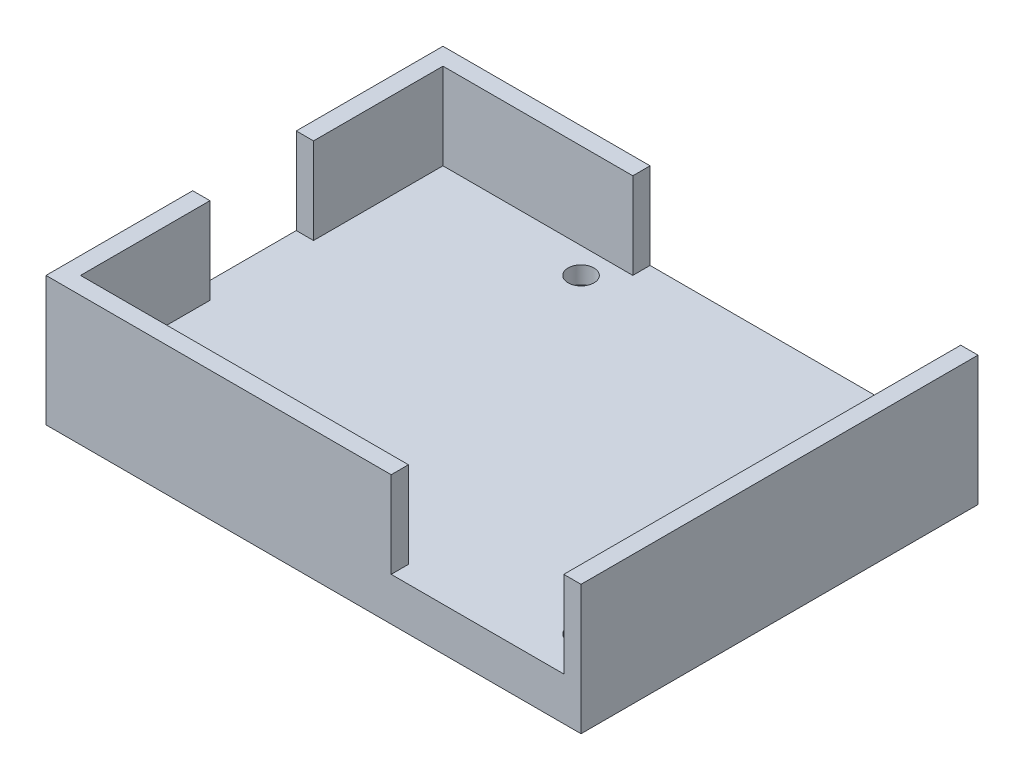
ISO-10303-21;
HEADER;
FILE_DESCRIPTION(('STEP AP214'),'2;1');
FILE_NAME('part.step','',(''),(''),'','','');
FILE_SCHEMA(('AUTOMOTIVE_DESIGN { 1 0 10303 214 1 1 1 1 }'));
ENDSEC;
DATA;
#1=APPLICATION_CONTEXT('core data for automotive mechanical design processes');
#2=APPLICATION_PROTOCOL_DEFINITION('international standard','automotive_design',2000,#1);
#3=PRODUCT_CONTEXT('',#1,'mechanical');
#4=PRODUCT('Part','Part','',(#3));
#5=PRODUCT_RELATED_PRODUCT_CATEGORY('part','',(#4));
#6=PRODUCT_DEFINITION_FORMATION('','',#4);
#7=PRODUCT_DEFINITION_CONTEXT('part definition',#1,'design');
#8=PRODUCT_DEFINITION('design','',#6,#7);
#9=PRODUCT_DEFINITION_SHAPE('','',#8);
#10=(LENGTH_UNIT() NAMED_UNIT(*) SI_UNIT(.MILLI.,.METRE.));
#11=(NAMED_UNIT(*) PLANE_ANGLE_UNIT() SI_UNIT($,.RADIAN.));
#12=(NAMED_UNIT(*) SI_UNIT($,.STERADIAN.) SOLID_ANGLE_UNIT());
#13=UNCERTAINTY_MEASURE_WITH_UNIT(LENGTH_MEASURE(1.E-05),#10,'distance_accuracy_value','');
#14=(GEOMETRIC_REPRESENTATION_CONTEXT(3) GLOBAL_UNCERTAINTY_ASSIGNED_CONTEXT((#13)) GLOBAL_UNIT_ASSIGNED_CONTEXT((#10,
#11,#12)) REPRESENTATION_CONTEXT('',''));
#15=CARTESIAN_POINT('',(0.,0.,0.));
#16=DIRECTION('',(0.,0.,1.));
#17=DIRECTION('',(1.,0.,0.));
#18=AXIS2_PLACEMENT_3D('',#15,#16,#17);
#19=CARTESIAN_POINT('',(26.,0.,18.));
#20=DIRECTION('',(0.,1.,0.));
#21=DIRECTION('',(0.,0.,1.));
#22=AXIS2_PLACEMENT_3D('',#19,#20,#21);
#23=CYLINDRICAL_SURFACE('',#22,1.5);
#24=CARTESIAN_POINT('',(26.,5.,18.));
#25=DIRECTION('',(0.,1.,0.));
#26=DIRECTION('',(0.,0.,1.));
#27=AXIS2_PLACEMENT_3D('',#24,#25,#26);
#28=CIRCLE('',#27,1.5);
#29=CARTESIAN_POINT('',(26.,5.,19.5));
#30=VERTEX_POINT('',#29);
#31=EDGE_CURVE('E182',#30,#30,#28,.T.);
#32=ORIENTED_EDGE('',*,*,#31,.T.);
#33=EDGE_LOOP('',(#32));
#34=FACE_BOUND('',#33,.T.);
#35=CARTESIAN_POINT('',(26.,3.,18.));
#36=DIRECTION('',(0.,-1.,0.));
#37=DIRECTION('',(0.,0.,-1.));
#38=AXIS2_PLACEMENT_3D('',#35,#36,#37);
#39=CIRCLE('',#38,1.5);
#40=CARTESIAN_POINT('',(26.,3.,16.5));
#41=VERTEX_POINT('',#40);
#42=EDGE_CURVE('E39',#41,#41,#39,.F.);
#43=ORIENTED_EDGE('',*,*,#42,.F.);
#44=EDGE_LOOP('',(#43));
#45=FACE_BOUND('',#44,.T.);
#46=ADVANCED_FACE('F35',(#34,#45),#23,.F.);
#47=CARTESIAN_POINT('',(26.,0.,-18.));
#48=DIRECTION('',(0.,1.,0.));
#49=DIRECTION('',(0.,0.,1.));
#50=AXIS2_PLACEMENT_3D('',#47,#48,#49);
#51=CYLINDRICAL_SURFACE('',#50,1.5);
#52=CARTESIAN_POINT('',(26.,5.,-18.));
#53=DIRECTION('',(0.,1.,0.));
#54=DIRECTION('',(0.,0.,1.));
#55=AXIS2_PLACEMENT_3D('',#52,#53,#54);
#56=CIRCLE('',#55,1.5);
#57=CARTESIAN_POINT('',(26.,5.,-16.5));
#58=VERTEX_POINT('',#57);
#59=EDGE_CURVE('E293',#58,#58,#56,.T.);
#60=ORIENTED_EDGE('',*,*,#59,.T.);
#61=EDGE_LOOP('',(#60));
#62=FACE_BOUND('',#61,.T.);
#63=CARTESIAN_POINT('',(26.,3.,-18.));
#64=DIRECTION('',(0.,-1.,0.));
#65=DIRECTION('',(0.,0.,-1.));
#66=AXIS2_PLACEMENT_3D('',#63,#64,#65);
#67=CIRCLE('',#66,1.5);
#68=CARTESIAN_POINT('',(26.,3.,-19.5));
#69=VERTEX_POINT('',#68);
#70=EDGE_CURVE('E279',#69,#69,#67,.F.);
#71=ORIENTED_EDGE('',*,*,#70,.F.);
#72=EDGE_LOOP('',(#71));
#73=FACE_BOUND('',#72,.T.);
#74=ADVANCED_FACE('F381',(#62,#73),#51,.F.);
#75=CARTESIAN_POINT('',(-10.,0.,-18.));
#76=DIRECTION('',(0.,1.,0.));
#77=DIRECTION('',(0.,0.,1.));
#78=AXIS2_PLACEMENT_3D('',#75,#76,#77);
#79=CYLINDRICAL_SURFACE('',#78,1.5);
#80=CARTESIAN_POINT('',(-10.,5.,-18.));
#81=DIRECTION('',(0.,1.,0.));
#82=DIRECTION('',(0.,0.,1.));
#83=AXIS2_PLACEMENT_3D('',#80,#81,#82);
#84=CIRCLE('',#83,1.5);
#85=CARTESIAN_POINT('',(-10.,5.,-16.5));
#86=VERTEX_POINT('',#85);
#87=EDGE_CURVE('E288',#86,#86,#84,.T.);
#88=ORIENTED_EDGE('',*,*,#87,.T.);
#89=EDGE_LOOP('',(#88));
#90=FACE_BOUND('',#89,.T.);
#91=CARTESIAN_POINT('',(-10.,3.,-18.));
#92=DIRECTION('',(0.,-1.,0.));
#93=DIRECTION('',(0.,0.,-1.));
#94=AXIS2_PLACEMENT_3D('',#91,#92,#93);
#95=CIRCLE('',#94,1.5);
#96=CARTESIAN_POINT('',(-10.,3.,-19.5));
#97=VERTEX_POINT('',#96);
#98=EDGE_CURVE('E276',#97,#97,#95,.F.);
#99=ORIENTED_EDGE('',*,*,#98,.F.);
#100=EDGE_LOOP('',(#99));
#101=FACE_BOUND('',#100,.T.);
#102=ADVANCED_FACE('F375',(#90,#101),#79,.F.);
#103=CARTESIAN_POINT('',(-9.99999999999999,0.,18.));
#104=DIRECTION('',(0.,1.,0.));
#105=DIRECTION('',(0.,0.,1.));
#106=AXIS2_PLACEMENT_3D('',#103,#104,#105);
#107=CYLINDRICAL_SURFACE('',#106,1.5);
#108=CARTESIAN_POINT('',(-9.99999999999999,5.,18.));
#109=DIRECTION('',(0.,1.,0.));
#110=DIRECTION('',(0.,0.,1.));
#111=AXIS2_PLACEMENT_3D('',#108,#109,#110);
#112=CIRCLE('',#111,1.5);
#113=CARTESIAN_POINT('',(-9.99999999999999,5.,19.5));
#114=VERTEX_POINT('',#113);
#115=EDGE_CURVE('E284',#114,#114,#112,.T.);
#116=ORIENTED_EDGE('',*,*,#115,.T.);
#117=EDGE_LOOP('',(#116));
#118=FACE_BOUND('',#117,.T.);
#119=CARTESIAN_POINT('',(-9.99999999999999,3.,18.));
#120=DIRECTION('',(0.,-1.,0.));
#121=DIRECTION('',(0.,0.,-1.));
#122=AXIS2_PLACEMENT_3D('',#119,#120,#121);
#123=CIRCLE('',#122,1.5);
#124=CARTESIAN_POINT('',(-9.99999999999999,3.,16.5));
#125=VERTEX_POINT('',#124);
#126=EDGE_CURVE('E273',#125,#125,#123,.F.);
#127=ORIENTED_EDGE('',*,*,#126,.F.);
#128=EDGE_LOOP('',(#127));
#129=FACE_BOUND('',#128,.T.);
#130=ADVANCED_FACE('F367',(#118,#129),#107,.F.);
#131=CARTESIAN_POINT('',(0.,15.,0.));
#132=DIRECTION('',(0.,1.,0.));
#133=DIRECTION('',(0.,0.,1.));
#134=AXIS2_PLACEMENT_3D('',#131,#132,#133);
#135=PLANE('',#134);
#136=DIRECTION('',(0.,0.,-1.));
#137=VECTOR('',#136,1.);
#138=CARTESIAN_POINT('',(29.,15.,-21.));
#139=LINE('',#138,#137);
#140=CARTESIAN_POINT('',(29.,15.,23.));
#141=VERTEX_POINT('',#140);
#142=CARTESIAN_POINT('',(29.,15.,-23.));
#143=VERTEX_POINT('',#142);
#144=EDGE_CURVE('E218',#141,#143,#139,.T.);
#145=ORIENTED_EDGE('',*,*,#144,.F.);
#146=DIRECTION('',(1.,0.,0.));
#147=VECTOR('',#146,1.);
#148=CARTESIAN_POINT('',(-31.,15.,23.));
#149=LINE('',#148,#147);
#150=CARTESIAN_POINT('',(31.,15.,23.));
#151=VERTEX_POINT('',#150);
#152=EDGE_CURVE('E177',#141,#151,#149,.T.);
#153=ORIENTED_EDGE('',*,*,#152,.T.);
#154=DIRECTION('',(0.,0.,-1.));
#155=VECTOR('',#154,1.);
#156=CARTESIAN_POINT('',(31.,15.,-23.));
#157=LINE('',#156,#155);
#158=CARTESIAN_POINT('',(31.,15.,-23.));
#159=VERTEX_POINT('',#158);
#160=EDGE_CURVE('E243',#151,#159,#157,.T.);
#161=ORIENTED_EDGE('',*,*,#160,.T.);
#162=DIRECTION('',(-1.,0.,0.));
#163=VECTOR('',#162,1.);
#164=CARTESIAN_POINT('',(-31.,15.,-23.));
#165=LINE('',#164,#163);
#166=EDGE_CURVE('E248',#159,#143,#165,.T.);
#167=ORIENTED_EDGE('',*,*,#166,.T.);
#168=EDGE_LOOP('',(#145,#153,#161,#167));
#169=FACE_BOUND('',#168,.T.);
#170=ADVANCED_FACE('F364',(#169),#135,.T.);
#171=DIRECTION('',(0.,0.,-1.));
#172=VECTOR('',#171,1.);
#173=CARTESIAN_POINT('',(9.00000000000001,15.,23.001));
#174=LINE('',#173,#172);
#175=CARTESIAN_POINT('',(9.00000000000001,15.,23.));
#176=VERTEX_POINT('',#175);
#177=CARTESIAN_POINT('',(9.00000000000001,15.,21.));
#178=VERTEX_POINT('',#177);
#179=EDGE_CURVE('E173',#176,#178,#174,.T.);
#180=ORIENTED_EDGE('',*,*,#179,.T.);
#181=DIRECTION('',(1.,0.,0.));
#182=VECTOR('',#181,1.);
#183=CARTESIAN_POINT('',(-29.,15.,21.));
#184=LINE('',#183,#182);
#185=CARTESIAN_POINT('',(-29.,15.,21.));
#186=VERTEX_POINT('',#185);
#187=EDGE_CURVE('E162',#186,#178,#184,.T.);
#188=ORIENTED_EDGE('',*,*,#187,.F.);
#189=DIRECTION('',(0.,0.,1.));
#190=VECTOR('',#189,1.);
#191=CARTESIAN_POINT('',(-29.,15.,-21.));
#192=LINE('',#191,#190);
#193=CARTESIAN_POINT('',(-29.,15.,6.00000000000001));
#194=VERTEX_POINT('',#193);
#195=EDGE_CURVE('E231',#194,#186,#192,.T.);
#196=ORIENTED_EDGE('',*,*,#195,.F.);
#197=DIRECTION('',(-1.,0.,0.));
#198=VECTOR('',#197,1.);
#199=CARTESIAN_POINT('',(31.001,15.,5.99999999999999));
#200=LINE('',#199,#198);
#201=CARTESIAN_POINT('',(-31.,15.,6.00000000000001));
#202=VERTEX_POINT('',#201);
#203=EDGE_CURVE('E201',#194,#202,#200,.T.);
#204=ORIENTED_EDGE('',*,*,#203,.T.);
#205=DIRECTION('',(0.,0.,1.));
#206=VECTOR('',#205,1.);
#207=CARTESIAN_POINT('',(-31.,15.,-23.));
#208=LINE('',#207,#206);
#209=CARTESIAN_POINT('',(-31.,15.,23.));
#210=VERTEX_POINT('',#209);
#211=EDGE_CURVE('E251',#202,#210,#208,.T.);
#212=ORIENTED_EDGE('',*,*,#211,.T.);
#213=EDGE_CURVE('E255',#210,#176,#149,.T.);
#214=ORIENTED_EDGE('',*,*,#213,.T.);
#215=EDGE_LOOP('',(#180,#188,#196,#204,#212,#214));
#216=FACE_BOUND('',#215,.T.);
#217=ADVANCED_FACE('F366',(#216),#135,.T.);
#218=CARTESIAN_POINT('',(-29.,5.,-21.));
#219=DIRECTION('',(-1.,0.,0.));
#220=DIRECTION('',(0.,0.,1.));
#221=AXIS2_PLACEMENT_3D('',#218,#219,#220);
#222=PLANE('',#221);
#223=CARTESIAN_POINT('',(-29.,15.,-21.));
#224=VERTEX_POINT('',#223);
#225=CARTESIAN_POINT('',(-29.,15.,-5.99999999999999));
#226=VERTEX_POINT('',#225);
#227=EDGE_CURVE('E232',#224,#226,#192,.T.);
#228=ORIENTED_EDGE('',*,*,#227,.T.);
#229=DIRECTION('',(0.,1.,0.));
#230=VECTOR('',#229,1.);
#231=CARTESIAN_POINT('',(-29.,25.,-5.99999999999999));
#232=LINE('',#231,#230);
#233=CARTESIAN_POINT('',(-29.,5.,-5.99999999999999));
#234=VERTEX_POINT('',#233);
#235=EDGE_CURVE('E216',#234,#226,#232,.T.);
#236=ORIENTED_EDGE('',*,*,#235,.F.);
#237=DIRECTION('',(0.,0.,1.));
#238=VECTOR('',#237,1.);
#239=CARTESIAN_POINT('',(-29.,5.,-21.));
#240=LINE('',#239,#238);
#241=CARTESIAN_POINT('',(-29.,5.,-21.));
#242=VERTEX_POINT('',#241);
#243=EDGE_CURVE('E222',#242,#234,#240,.T.);
#244=ORIENTED_EDGE('',*,*,#243,.F.);
#245=DIRECTION('',(0.,1.,0.));
#246=VECTOR('',#245,1.);
#247=CARTESIAN_POINT('',(-29.,5.,-21.));
#248=LINE('',#247,#246);
#249=EDGE_CURVE('E227',#242,#224,#248,.T.);
#250=ORIENTED_EDGE('',*,*,#249,.T.);
#251=EDGE_LOOP('',(#228,#236,#244,#250));
#252=FACE_BOUND('',#251,.T.);
#253=ADVANCED_FACE('F373',(#252),#222,.F.);
#254=CARTESIAN_POINT('',(31.,15.,-23.));
#255=DIRECTION('',(-1.,0.,0.));
#256=DIRECTION('',(0.,0.,1.));
#257=AXIS2_PLACEMENT_3D('',#254,#255,#256);
#258=PLANE('',#257);
#259=DIRECTION('',(0.,0.,-1.));
#260=VECTOR('',#259,1.);
#261=CARTESIAN_POINT('',(31.,0.,-23.));
#262=LINE('',#261,#260);
#263=CARTESIAN_POINT('',(31.,0.,23.));
#264=VERTEX_POINT('',#263);
#265=CARTESIAN_POINT('',(31.,0.,-23.));
#266=VERTEX_POINT('',#265);
#267=EDGE_CURVE('E240',#264,#266,#262,.T.);
#268=ORIENTED_EDGE('',*,*,#267,.T.);
#269=DIRECTION('',(0.,-1.,0.));
#270=VECTOR('',#269,1.);
#271=CARTESIAN_POINT('',(31.,15.,-23.));
#272=LINE('',#271,#270);
#273=EDGE_CURVE('E11',#159,#266,#272,.T.);
#274=ORIENTED_EDGE('',*,*,#273,.F.);
#275=ORIENTED_EDGE('',*,*,#160,.F.);
#276=DIRECTION('',(0.,-1.,0.));
#277=VECTOR('',#276,1.);
#278=CARTESIAN_POINT('',(31.,15.,23.));
#279=LINE('',#278,#277);
#280=EDGE_CURVE('E258',#151,#264,#279,.T.);
#281=ORIENTED_EDGE('',*,*,#280,.T.);
#282=EDGE_LOOP('',(#268,#274,#275,#281));
#283=FACE_BOUND('',#282,.T.);
#284=ADVANCED_FACE('F37',(#283),#258,.F.);
#285=CARTESIAN_POINT('',(-31.,15.,-23.));
#286=DIRECTION('',(0.,0.,1.));
#287=DIRECTION('',(1.,0.,0.));
#288=AXIS2_PLACEMENT_3D('',#285,#286,#287);
#289=PLANE('',#288);
#290=DIRECTION('',(-1.,0.,0.));
#291=VECTOR('',#290,1.);
#292=CARTESIAN_POINT('',(29.,5.,-23.));
#293=LINE('',#292,#291);
#294=CARTESIAN_POINT('',(29.,5.,-23.));
#295=VERTEX_POINT('',#294);
#296=CARTESIAN_POINT('',(-7.,5.,-23.));
#297=VERTEX_POINT('',#296);
#298=EDGE_CURVE('E190',#295,#297,#293,.T.);
#299=ORIENTED_EDGE('',*,*,#298,.F.);
#300=DIRECTION('',(0.,-1.,0.));
#301=VECTOR('',#300,1.);
#302=CARTESIAN_POINT('',(29.,15.,-23.));
#303=LINE('',#302,#301);
#304=EDGE_CURVE('E157',#143,#295,#303,.T.);
#305=ORIENTED_EDGE('',*,*,#304,.F.);
#306=ORIENTED_EDGE('',*,*,#166,.F.);
#307=ORIENTED_EDGE('',*,*,#273,.T.);
#308=DIRECTION('',(-1.,0.,0.));
#309=VECTOR('',#308,1.);
#310=CARTESIAN_POINT('',(-31.,0.,-23.));
#311=LINE('',#310,#309);
#312=CARTESIAN_POINT('',(-31.,0.,-23.));
#313=VERTEX_POINT('',#312);
#314=EDGE_CURVE('E261',#266,#313,#311,.T.);
#315=ORIENTED_EDGE('',*,*,#314,.T.);
#316=DIRECTION('',(0.,-1.,0.));
#317=VECTOR('',#316,1.);
#318=CARTESIAN_POINT('',(-31.,15.,-23.));
#319=LINE('',#318,#317);
#320=CARTESIAN_POINT('',(-31.,15.,-23.));
#321=VERTEX_POINT('',#320);
#322=EDGE_CURVE('E44',#321,#313,#319,.T.);
#323=ORIENTED_EDGE('',*,*,#322,.F.);
#324=CARTESIAN_POINT('',(-7.,15.,-23.));
#325=VERTEX_POINT('',#324);
#326=EDGE_CURVE('E246',#325,#321,#165,.T.);
#327=ORIENTED_EDGE('',*,*,#326,.F.);
#328=DIRECTION('',(0.,1.,0.));
#329=VECTOR('',#328,1.);
#330=CARTESIAN_POINT('',(-7.,15.,-23.));
#331=LINE('',#330,#329);
#332=EDGE_CURVE('E172',#297,#325,#331,.T.);
#333=ORIENTED_EDGE('',*,*,#332,.F.);
#334=EDGE_LOOP('',(#299,#305,#306,#307,#315,#323,#327,#333));
#335=FACE_BOUND('',#334,.T.);
#336=ADVANCED_FACE('F361',(#335),#289,.F.);
#337=CARTESIAN_POINT('',(-31.,15.,-23.));
#338=DIRECTION('',(1.,0.,0.));
#339=DIRECTION('',(0.,0.,-1.));
#340=AXIS2_PLACEMENT_3D('',#337,#338,#339);
#341=PLANE('',#340);
#342=DIRECTION('',(0.,0.,1.));
#343=VECTOR('',#342,1.);
#344=CARTESIAN_POINT('',(-31.,5.,-5.99999999999999));
#345=LINE('',#344,#343);
#346=CARTESIAN_POINT('',(-31.,5.,-5.99999999999999));
#347=VERTEX_POINT('',#346);
#348=CARTESIAN_POINT('',(-31.,5.,6.00000000000001));
#349=VERTEX_POINT('',#348);
#350=EDGE_CURVE('E208',#347,#349,#345,.T.);
#351=ORIENTED_EDGE('',*,*,#350,.F.);
#352=DIRECTION('',(0.,-1.,0.));
#353=VECTOR('',#352,1.);
#354=CARTESIAN_POINT('',(-31.,25.,-5.99999999999999));
#355=LINE('',#354,#353);
#356=CARTESIAN_POINT('',(-31.,15.,-5.99999999999999));
#357=VERTEX_POINT('',#356);
#358=EDGE_CURVE('E205',#357,#347,#355,.T.);
#359=ORIENTED_EDGE('',*,*,#358,.F.);
#360=EDGE_CURVE('E252',#321,#357,#208,.T.);
#361=ORIENTED_EDGE('',*,*,#360,.F.);
#362=ORIENTED_EDGE('',*,*,#322,.T.);
#363=DIRECTION('',(0.,0.,1.));
#364=VECTOR('',#363,1.);
#365=CARTESIAN_POINT('',(-31.,0.,-23.));
#366=LINE('',#365,#364);
#367=CARTESIAN_POINT('',(-31.,0.,23.));
#368=VERTEX_POINT('',#367);
#369=EDGE_CURVE('E263',#313,#368,#366,.T.);
#370=ORIENTED_EDGE('',*,*,#369,.T.);
#371=DIRECTION('',(0.,-1.,0.));
#372=VECTOR('',#371,1.);
#373=CARTESIAN_POINT('',(-31.,15.,23.));
#374=LINE('',#373,#372);
#375=EDGE_CURVE('E268',#210,#368,#374,.T.);
#376=ORIENTED_EDGE('',*,*,#375,.F.);
#377=ORIENTED_EDGE('',*,*,#211,.F.);
#378=DIRECTION('',(0.,1.,0.));
#379=VECTOR('',#378,1.);
#380=CARTESIAN_POINT('',(-31.,25.,6.00000000000001));
#381=LINE('',#380,#379);
#382=EDGE_CURVE('E211',#349,#202,#381,.T.);
#383=ORIENTED_EDGE('',*,*,#382,.F.);
#384=EDGE_LOOP('',(#351,#359,#361,#362,#370,#376,#377,#383));
#385=FACE_BOUND('',#384,.T.);
#386=ADVANCED_FACE('F354',(#385),#341,.F.);
#387=CARTESIAN_POINT('',(-31.,15.,23.));
#388=DIRECTION('',(0.,0.,-1.));
#389=DIRECTION('',(-1.,0.,0.));
#390=AXIS2_PLACEMENT_3D('',#387,#388,#389);
#391=PLANE('',#390);
#392=ORIENTED_EDGE('',*,*,#152,.F.);
#393=DIRECTION('',(0.,1.,0.));
#394=VECTOR('',#393,1.);
#395=CARTESIAN_POINT('',(29.,15.,23.));
#396=LINE('',#395,#394);
#397=CARTESIAN_POINT('',(29.,5.,23.));
#398=VERTEX_POINT('',#397);
#399=EDGE_CURVE('E154',#398,#141,#396,.T.);
#400=ORIENTED_EDGE('',*,*,#399,.F.);
#401=DIRECTION('',(1.,0.,0.));
#402=VECTOR('',#401,1.);
#403=CARTESIAN_POINT('',(29.,5.,23.));
#404=LINE('',#403,#402);
#405=CARTESIAN_POINT('',(9.00000000000001,5.,23.));
#406=VERTEX_POINT('',#405);
#407=EDGE_CURVE('E165',#406,#398,#404,.T.);
#408=ORIENTED_EDGE('',*,*,#407,.F.);
#409=DIRECTION('',(0.,-1.,0.));
#410=VECTOR('',#409,1.);
#411=CARTESIAN_POINT('',(9.00000000000001,15.,23.));
#412=LINE('',#411,#410);
#413=EDGE_CURVE('E179',#176,#406,#412,.T.);
#414=ORIENTED_EDGE('',*,*,#413,.F.);
#415=ORIENTED_EDGE('',*,*,#213,.F.);
#416=ORIENTED_EDGE('',*,*,#375,.T.);
#417=DIRECTION('',(1.,0.,0.));
#418=VECTOR('',#417,1.);
#419=CARTESIAN_POINT('',(-31.,0.,23.));
#420=LINE('',#419,#418);
#421=EDGE_CURVE('E247',#368,#264,#420,.T.);
#422=ORIENTED_EDGE('',*,*,#421,.T.);
#423=ORIENTED_EDGE('',*,*,#280,.F.);
#424=EDGE_LOOP('',(#392,#400,#408,#414,#415,#416,#422,#423));
#425=FACE_BOUND('',#424,.T.);
#426=ADVANCED_FACE('F175',(#425),#391,.F.);
#427=DIRECTION('',(0.,0.,1.));
#428=VECTOR('',#427,1.);
#429=CARTESIAN_POINT('',(-7.,15.,-23.001));
#430=LINE('',#429,#428);
#431=CARTESIAN_POINT('',(-7.,15.,-21.));
#432=VERTEX_POINT('',#431);
#433=EDGE_CURVE('E194',#325,#432,#430,.T.);
#434=ORIENTED_EDGE('',*,*,#433,.F.);
#435=ORIENTED_EDGE('',*,*,#326,.T.);
#436=ORIENTED_EDGE('',*,*,#360,.T.);
#437=DIRECTION('',(1.,0.,0.));
#438=VECTOR('',#437,1.);
#439=CARTESIAN_POINT('',(31.001,15.,-6.00000000000001));
#440=LINE('',#439,#438);
#441=EDGE_CURVE('E197',#357,#226,#440,.T.);
#442=ORIENTED_EDGE('',*,*,#441,.T.);
#443=ORIENTED_EDGE('',*,*,#227,.F.);
#444=DIRECTION('',(-1.,0.,0.));
#445=VECTOR('',#444,1.);
#446=CARTESIAN_POINT('',(-29.,15.,-21.));
#447=LINE('',#446,#445);
#448=EDGE_CURVE('E229',#432,#224,#447,.T.);
#449=ORIENTED_EDGE('',*,*,#448,.F.);
#450=EDGE_LOOP('',(#434,#435,#436,#442,#443,#449));
#451=FACE_BOUND('',#450,.T.);
#452=ADVANCED_FACE('F338',(#451),#135,.T.);
#453=CARTESIAN_POINT('',(0.,0.,0.));
#454=DIRECTION('',(0.,1.,0.));
#455=DIRECTION('',(0.,0.,1.));
#456=AXIS2_PLACEMENT_3D('',#453,#454,#455);
#457=PLANE('',#456);
#458=CARTESIAN_POINT('',(-10.,0.,-18.));
#459=DIRECTION('',(0.,-1.,0.));
#460=DIRECTION('',(0.,0.,-1.));
#461=AXIS2_PLACEMENT_3D('',#458,#459,#460);
#462=CIRCLE('',#461,2.);
#463=CARTESIAN_POINT('',(-10.,0.,-20.));
#464=VERTEX_POINT('',#463);
#465=EDGE_CURVE('E309',#464,#464,#462,.T.);
#466=ORIENTED_EDGE('',*,*,#465,.F.);
#467=EDGE_LOOP('',(#466));
#468=FACE_BOUND('',#467,.T.);
#469=CARTESIAN_POINT('',(26.,0.,-18.));
#470=DIRECTION('',(0.,-1.,0.));
#471=DIRECTION('',(0.,0.,-1.));
#472=AXIS2_PLACEMENT_3D('',#469,#470,#471);
#473=CIRCLE('',#472,2.);
#474=CARTESIAN_POINT('',(26.,0.,-20.));
#475=VERTEX_POINT('',#474);
#476=EDGE_CURVE('E315',#475,#475,#473,.T.);
#477=ORIENTED_EDGE('',*,*,#476,.F.);
#478=EDGE_LOOP('',(#477));
#479=FACE_BOUND('',#478,.T.);
#480=CARTESIAN_POINT('',(26.,0.,18.));
#481=DIRECTION('',(0.,-1.,0.));
#482=DIRECTION('',(0.,0.,-1.));
#483=AXIS2_PLACEMENT_3D('',#480,#481,#482);
#484=CIRCLE('',#483,2.);
#485=CARTESIAN_POINT('',(26.,0.,16.));
#486=VERTEX_POINT('',#485);
#487=EDGE_CURVE('E321',#486,#486,#484,.T.);
#488=ORIENTED_EDGE('',*,*,#487,.F.);
#489=EDGE_LOOP('',(#488));
#490=FACE_BOUND('',#489,.T.);
#491=CARTESIAN_POINT('',(-9.99999999999999,0.,18.));
#492=DIRECTION('',(0.,-1.,0.));
#493=DIRECTION('',(0.,0.,-1.));
#494=AXIS2_PLACEMENT_3D('',#491,#492,#493);
#495=CIRCLE('',#494,2.);
#496=CARTESIAN_POINT('',(-9.99999999999999,0.,16.));
#497=VERTEX_POINT('',#496);
#498=EDGE_CURVE('E303',#497,#497,#495,.T.);
#499=ORIENTED_EDGE('',*,*,#498,.F.);
#500=EDGE_LOOP('',(#499));
#501=FACE_BOUND('',#500,.T.);
#502=ORIENTED_EDGE('',*,*,#267,.F.);
#503=ORIENTED_EDGE('',*,*,#421,.F.);
#504=ORIENTED_EDGE('',*,*,#369,.F.);
#505=ORIENTED_EDGE('',*,*,#314,.F.);
#506=EDGE_LOOP('',(#502,#503,#504,#505));
#507=FACE_BOUND('',#506,.T.);
#508=ADVANCED_FACE('F335',(#468,#479,#490,#501,#507),#457,.F.);
#509=CARTESIAN_POINT('',(29.,5.,-21.));
#510=DIRECTION('',(1.,0.,0.));
#511=DIRECTION('',(0.,0.,-1.));
#512=AXIS2_PLACEMENT_3D('',#509,#510,#511);
#513=PLANE('',#512);
#514=ORIENTED_EDGE('',*,*,#144,.T.);
#515=ORIENTED_EDGE('',*,*,#304,.T.);
#516=DIRECTION('',(0.,0.,-1.));
#517=VECTOR('',#516,1.);
#518=CARTESIAN_POINT('',(29.,5.,-21.));
#519=LINE('',#518,#517);
#520=EDGE_CURVE('E150',#398,#295,#519,.T.);
#521=ORIENTED_EDGE('',*,*,#520,.F.);
#522=ORIENTED_EDGE('',*,*,#399,.T.);
#523=EDGE_LOOP('',(#514,#515,#521,#522));
#524=FACE_BOUND('',#523,.T.);
#525=ADVANCED_FACE('F152',(#524),#513,.F.);
#526=CARTESIAN_POINT('',(-29.,5.,21.));
#527=DIRECTION('',(0.,0.,1.));
#528=DIRECTION('',(1.,0.,0.));
#529=AXIS2_PLACEMENT_3D('',#526,#527,#528);
#530=PLANE('',#529);
#531=ORIENTED_EDGE('',*,*,#187,.T.);
#532=DIRECTION('',(0.,1.,0.));
#533=VECTOR('',#532,1.);
#534=CARTESIAN_POINT('',(9.00000000000001,15.,21.));
#535=LINE('',#534,#533);
#536=CARTESIAN_POINT('',(9.00000000000001,5.,21.));
#537=VERTEX_POINT('',#536);
#538=EDGE_CURVE('E178',#537,#178,#535,.T.);
#539=ORIENTED_EDGE('',*,*,#538,.F.);
#540=DIRECTION('',(1.,0.,0.));
#541=VECTOR('',#540,1.);
#542=CARTESIAN_POINT('',(-29.,5.,21.));
#543=LINE('',#542,#541);
#544=CARTESIAN_POINT('',(-29.,5.,21.));
#545=VERTEX_POINT('',#544);
#546=EDGE_CURVE('E225',#545,#537,#543,.T.);
#547=ORIENTED_EDGE('',*,*,#546,.F.);
#548=DIRECTION('',(0.,1.,0.));
#549=VECTOR('',#548,1.);
#550=CARTESIAN_POINT('',(-29.,5.,21.));
#551=LINE('',#550,#549);
#552=EDGE_CURVE('E237',#545,#186,#551,.T.);
#553=ORIENTED_EDGE('',*,*,#552,.T.);
#554=EDGE_LOOP('',(#531,#539,#547,#553));
#555=FACE_BOUND('',#554,.T.);
#556=ADVANCED_FACE('F409',(#555),#530,.F.);
#557=CARTESIAN_POINT('',(-29.,5.,5.99999999999999));
#558=VERTEX_POINT('',#557);
#559=EDGE_CURVE('E221',#558,#545,#240,.T.);
#560=ORIENTED_EDGE('',*,*,#559,.F.);
#561=DIRECTION('',(0.,-1.,0.));
#562=VECTOR('',#561,1.);
#563=CARTESIAN_POINT('',(-29.,25.,6.00000000000001));
#564=LINE('',#563,#562);
#565=EDGE_CURVE('E60',#194,#558,#564,.T.);
#566=ORIENTED_EDGE('',*,*,#565,.F.);
#567=ORIENTED_EDGE('',*,*,#195,.T.);
#568=ORIENTED_EDGE('',*,*,#552,.F.);
#569=EDGE_LOOP('',(#560,#566,#567,#568));
#570=FACE_BOUND('',#569,.T.);
#571=ADVANCED_FACE('F412',(#570),#222,.F.);
#572=CARTESIAN_POINT('',(-29.,5.,-21.));
#573=DIRECTION('',(0.,0.,-1.));
#574=DIRECTION('',(-1.,0.,0.));
#575=AXIS2_PLACEMENT_3D('',#572,#573,#574);
#576=PLANE('',#575);
#577=DIRECTION('',(-1.,0.,0.));
#578=VECTOR('',#577,1.);
#579=CARTESIAN_POINT('',(-29.,5.,-21.));
#580=LINE('',#579,#578);
#581=CARTESIAN_POINT('',(-7.00000000000001,5.,-21.));
#582=VERTEX_POINT('',#581);
#583=EDGE_CURVE('E161',#582,#242,#580,.T.);
#584=ORIENTED_EDGE('',*,*,#583,.F.);
#585=DIRECTION('',(0.,-1.,0.));
#586=VECTOR('',#585,1.);
#587=CARTESIAN_POINT('',(-7.,15.,-21.));
#588=LINE('',#587,#586);
#589=EDGE_CURVE('E52',#432,#582,#588,.T.);
#590=ORIENTED_EDGE('',*,*,#589,.F.);
#591=ORIENTED_EDGE('',*,*,#448,.T.);
#592=ORIENTED_EDGE('',*,*,#249,.F.);
#593=EDGE_LOOP('',(#584,#590,#591,#592));
#594=FACE_BOUND('',#593,.T.);
#595=ADVANCED_FACE('F407',(#594),#576,.F.);
#596=CARTESIAN_POINT('',(0.,5.,0.));
#597=DIRECTION('',(0.,1.,0.));
#598=DIRECTION('',(0.,0.,1.));
#599=AXIS2_PLACEMENT_3D('',#596,#597,#598);
#600=PLANE('',#599);
#601=ORIENTED_EDGE('',*,*,#115,.F.);
#602=EDGE_LOOP('',(#601));
#603=FACE_BOUND('',#602,.T.);
#604=ORIENTED_EDGE('',*,*,#87,.F.);
#605=EDGE_LOOP('',(#604));
#606=FACE_BOUND('',#605,.T.);
#607=ORIENTED_EDGE('',*,*,#59,.F.);
#608=EDGE_LOOP('',(#607));
#609=FACE_BOUND('',#608,.T.);
#610=ORIENTED_EDGE('',*,*,#31,.F.);
#611=EDGE_LOOP('',(#610));
#612=FACE_BOUND('',#611,.T.);
#613=ORIENTED_EDGE('',*,*,#520,.T.);
#614=ORIENTED_EDGE('',*,*,#298,.T.);
#615=DIRECTION('',(0.,0.,1.));
#616=VECTOR('',#615,1.);
#617=CARTESIAN_POINT('',(-7.,5.,-23.001));
#618=LINE('',#617,#616);
#619=EDGE_CURVE('E195',#297,#582,#618,.T.);
#620=ORIENTED_EDGE('',*,*,#619,.T.);
#621=ORIENTED_EDGE('',*,*,#583,.T.);
#622=ORIENTED_EDGE('',*,*,#243,.T.);
#623=DIRECTION('',(-1.,0.,0.));
#624=VECTOR('',#623,1.);
#625=CARTESIAN_POINT('',(31.001,5.,-6.00000000000001));
#626=LINE('',#625,#624);
#627=EDGE_CURVE('E213',#234,#347,#626,.T.);
#628=ORIENTED_EDGE('',*,*,#627,.T.);
#629=ORIENTED_EDGE('',*,*,#350,.T.);
#630=DIRECTION('',(-1.,0.,0.));
#631=VECTOR('',#630,1.);
#632=CARTESIAN_POINT('',(31.001,5.,5.99999999999999));
#633=LINE('',#632,#631);
#634=EDGE_CURVE('E214',#558,#349,#633,.T.);
#635=ORIENTED_EDGE('',*,*,#634,.F.);
#636=ORIENTED_EDGE('',*,*,#559,.T.);
#637=ORIENTED_EDGE('',*,*,#546,.T.);
#638=DIRECTION('',(0.,0.,-1.));
#639=VECTOR('',#638,1.);
#640=CARTESIAN_POINT('',(9.00000000000001,5.,23.001));
#641=LINE('',#640,#639);
#642=EDGE_CURVE('E168',#406,#537,#641,.T.);
#643=ORIENTED_EDGE('',*,*,#642,.F.);
#644=ORIENTED_EDGE('',*,*,#407,.T.);
#645=EDGE_LOOP('',(#613,#614,#620,#621,#622,#628,#629,#635,#636,#637,#643,#644));
#646=FACE_BOUND('',#645,.T.);
#647=ADVANCED_FACE('F166',(#603,#606,#609,#612,#646),#600,.T.);
#648=CARTESIAN_POINT('',(31.001,25.,-6.00000000000001));
#649=DIRECTION('',(0.,0.,-1.));
#650=DIRECTION('',(-1.,0.,0.));
#651=AXIS2_PLACEMENT_3D('',#648,#649,#650);
#652=PLANE('',#651);
#653=ORIENTED_EDGE('',*,*,#358,.T.);
#654=ORIENTED_EDGE('',*,*,#627,.F.);
#655=ORIENTED_EDGE('',*,*,#235,.T.);
#656=ORIENTED_EDGE('',*,*,#441,.F.);
#657=EDGE_LOOP('',(#653,#654,#655,#656));
#658=FACE_BOUND('',#657,.T.);
#659=ADVANCED_FACE('F401',(#658),#652,.F.);
#660=CARTESIAN_POINT('',(31.001,25.,5.99999999999999));
#661=DIRECTION('',(0.,0.,1.));
#662=DIRECTION('',(1.,0.,0.));
#663=AXIS2_PLACEMENT_3D('',#660,#661,#662);
#664=PLANE('',#663);
#665=ORIENTED_EDGE('',*,*,#565,.T.);
#666=ORIENTED_EDGE('',*,*,#634,.T.);
#667=ORIENTED_EDGE('',*,*,#382,.T.);
#668=ORIENTED_EDGE('',*,*,#203,.F.);
#669=EDGE_LOOP('',(#665,#666,#667,#668));
#670=FACE_BOUND('',#669,.T.);
#671=ADVANCED_FACE('F398',(#670),#664,.F.);
#672=CARTESIAN_POINT('',(-7.,15.,-23.001));
#673=DIRECTION('',(-1.,0.,0.));
#674=DIRECTION('',(0.,0.,1.));
#675=AXIS2_PLACEMENT_3D('',#672,#673,#674);
#676=PLANE('',#675);
#677=ORIENTED_EDGE('',*,*,#332,.T.);
#678=ORIENTED_EDGE('',*,*,#433,.T.);
#679=ORIENTED_EDGE('',*,*,#589,.T.);
#680=ORIENTED_EDGE('',*,*,#619,.F.);
#681=EDGE_LOOP('',(#677,#678,#679,#680));
#682=FACE_BOUND('',#681,.T.);
#683=ADVANCED_FACE('F394',(#682),#676,.F.);
#684=CARTESIAN_POINT('',(9.00000000000001,15.,23.001));
#685=DIRECTION('',(-1.,0.,0.));
#686=DIRECTION('',(0.,0.,1.));
#687=AXIS2_PLACEMENT_3D('',#684,#685,#686);
#688=PLANE('',#687);
#689=ORIENTED_EDGE('',*,*,#413,.T.);
#690=ORIENTED_EDGE('',*,*,#642,.T.);
#691=ORIENTED_EDGE('',*,*,#538,.T.);
#692=ORIENTED_EDGE('',*,*,#179,.F.);
#693=EDGE_LOOP('',(#689,#690,#691,#692));
#694=FACE_BOUND('',#693,.T.);
#695=ADVANCED_FACE('F390',(#694),#688,.F.);
#696=CARTESIAN_POINT('',(-9.99999999999999,3.,18.));
#697=DIRECTION('',(0.,-1.,0.));
#698=DIRECTION('',(0.,0.,-1.));
#699=AXIS2_PLACEMENT_3D('',#696,#697,#698);
#700=PLANE('',#699);
#701=CARTESIAN_POINT('',(-9.99999999999999,3.,18.));
#702=DIRECTION('',(0.,-1.,0.));
#703=DIRECTION('',(0.,0.,-1.));
#704=AXIS2_PLACEMENT_3D('',#701,#702,#703);
#705=CIRCLE('',#704,2.);
#706=CARTESIAN_POINT('',(-9.99999999999999,3.,16.));
#707=VERTEX_POINT('',#706);
#708=EDGE_CURVE('E277',#707,#707,#705,.T.);
#709=ORIENTED_EDGE('',*,*,#708,.T.);
#710=EDGE_LOOP('',(#709));
#711=FACE_BOUND('',#710,.T.);
#712=ORIENTED_EDGE('',*,*,#126,.T.);
#713=EDGE_LOOP('',(#712));
#714=FACE_BOUND('',#713,.T.);
#715=ADVANCED_FACE('F393',(#711,#714),#700,.T.);
#716=CARTESIAN_POINT('',(-9.99999999999999,3.,18.));
#717=DIRECTION('',(0.,-1.,0.));
#718=DIRECTION('',(0.,0.,-1.));
#719=AXIS2_PLACEMENT_3D('',#716,#717,#718);
#720=CYLINDRICAL_SURFACE('',#719,2.);
#721=ORIENTED_EDGE('',*,*,#708,.F.);
#722=EDGE_LOOP('',(#721));
#723=FACE_BOUND('',#722,.T.);
#724=ORIENTED_EDGE('',*,*,#498,.T.);
#725=EDGE_LOOP('',(#724));
#726=FACE_BOUND('',#725,.T.);
#727=ADVANCED_FACE('F466',(#723,#726),#720,.F.);
#728=CARTESIAN_POINT('',(-10.,3.,-18.));
#729=DIRECTION('',(0.,-1.,0.));
#730=DIRECTION('',(0.,0.,-1.));
#731=AXIS2_PLACEMENT_3D('',#728,#729,#730);
#732=PLANE('',#731);
#733=CARTESIAN_POINT('',(-10.,3.,-18.));
#734=DIRECTION('',(0.,-1.,0.));
#735=DIRECTION('',(0.,0.,-1.));
#736=AXIS2_PLACEMENT_3D('',#733,#734,#735);
#737=CIRCLE('',#736,2.);
#738=CARTESIAN_POINT('',(-10.,3.,-20.));
#739=VERTEX_POINT('',#738);
#740=EDGE_CURVE('E312',#739,#739,#737,.T.);
#741=ORIENTED_EDGE('',*,*,#740,.T.);
#742=EDGE_LOOP('',(#741));
#743=FACE_BOUND('',#742,.T.);
#744=ORIENTED_EDGE('',*,*,#98,.T.);
#745=EDGE_LOOP('',(#744));
#746=FACE_BOUND('',#745,.T.);
#747=ADVANCED_FACE('F474',(#743,#746),#732,.T.);
#748=CARTESIAN_POINT('',(-10.,3.,-18.));
#749=DIRECTION('',(0.,-1.,0.));
#750=DIRECTION('',(0.,0.,-1.));
#751=AXIS2_PLACEMENT_3D('',#748,#749,#750);
#752=CYLINDRICAL_SURFACE('',#751,2.);
#753=ORIENTED_EDGE('',*,*,#740,.F.);
#754=EDGE_LOOP('',(#753));
#755=FACE_BOUND('',#754,.T.);
#756=ORIENTED_EDGE('',*,*,#465,.T.);
#757=EDGE_LOOP('',(#756));
#758=FACE_BOUND('',#757,.T.);
#759=ADVANCED_FACE('F482',(#755,#758),#752,.F.);
#760=CARTESIAN_POINT('',(26.,3.,-18.));
#761=DIRECTION('',(0.,-1.,0.));
#762=DIRECTION('',(0.,0.,-1.));
#763=AXIS2_PLACEMENT_3D('',#760,#761,#762);
#764=PLANE('',#763);
#765=CARTESIAN_POINT('',(26.,3.,-18.));
#766=DIRECTION('',(0.,-1.,0.));
#767=DIRECTION('',(0.,0.,-1.));
#768=AXIS2_PLACEMENT_3D('',#765,#766,#767);
#769=CIRCLE('',#768,2.);
#770=CARTESIAN_POINT('',(26.,3.,-20.));
#771=VERTEX_POINT('',#770);
#772=EDGE_CURVE('E318',#771,#771,#769,.T.);
#773=ORIENTED_EDGE('',*,*,#772,.T.);
#774=EDGE_LOOP('',(#773));
#775=FACE_BOUND('',#774,.T.);
#776=ORIENTED_EDGE('',*,*,#70,.T.);
#777=EDGE_LOOP('',(#776));
#778=FACE_BOUND('',#777,.T.);
#779=ADVANCED_FACE('F490',(#775,#778),#764,.T.);
#780=CARTESIAN_POINT('',(26.,3.,-18.));
#781=DIRECTION('',(0.,-1.,0.));
#782=DIRECTION('',(0.,0.,-1.));
#783=AXIS2_PLACEMENT_3D('',#780,#781,#782);
#784=CYLINDRICAL_SURFACE('',#783,2.);
#785=ORIENTED_EDGE('',*,*,#772,.F.);
#786=EDGE_LOOP('',(#785));
#787=FACE_BOUND('',#786,.T.);
#788=ORIENTED_EDGE('',*,*,#476,.T.);
#789=EDGE_LOOP('',(#788));
#790=FACE_BOUND('',#789,.T.);
#791=ADVANCED_FACE('F498',(#787,#790),#784,.F.);
#792=CARTESIAN_POINT('',(26.,3.,18.));
#793=DIRECTION('',(0.,-1.,0.));
#794=DIRECTION('',(0.,0.,-1.));
#795=AXIS2_PLACEMENT_3D('',#792,#793,#794);
#796=PLANE('',#795);
#797=CARTESIAN_POINT('',(26.,3.,18.));
#798=DIRECTION('',(0.,-1.,0.));
#799=DIRECTION('',(0.,0.,-1.));
#800=AXIS2_PLACEMENT_3D('',#797,#798,#799);
#801=CIRCLE('',#800,2.);
#802=CARTESIAN_POINT('',(26.,3.,16.));
#803=VERTEX_POINT('',#802);
#804=EDGE_CURVE('E306',#803,#803,#801,.T.);
#805=ORIENTED_EDGE('',*,*,#804,.T.);
#806=EDGE_LOOP('',(#805));
#807=FACE_BOUND('',#806,.T.);
#808=ORIENTED_EDGE('',*,*,#42,.T.);
#809=EDGE_LOOP('',(#808));
#810=FACE_BOUND('',#809,.T.);
#811=ADVANCED_FACE('F327',(#807,#810),#796,.T.);
#812=CARTESIAN_POINT('',(26.,3.,18.));
#813=DIRECTION('',(0.,-1.,0.));
#814=DIRECTION('',(0.,0.,-1.));
#815=AXIS2_PLACEMENT_3D('',#812,#813,#814);
#816=CYLINDRICAL_SURFACE('',#815,2.);
#817=ORIENTED_EDGE('',*,*,#804,.F.);
#818=EDGE_LOOP('',(#817));
#819=FACE_BOUND('',#818,.T.);
#820=ORIENTED_EDGE('',*,*,#487,.T.);
#821=EDGE_LOOP('',(#820));
#822=FACE_BOUND('',#821,.T.);
#823=ADVANCED_FACE('F329',(#819,#822),#816,.F.);
#824=CLOSED_SHELL('',(#46,#74,#102,#130,#170,#217,#253,#284,#336,#386,#426,#452,#508,#525,#556,
#571,#595,#647,#659,#671,#683,#695,#715,#727,#747,#759,#779,#791,#811,#823));
#825=MANIFOLD_SOLID_BREP('B2',#824);
#826=ADVANCED_BREP_SHAPE_REPRESENTATION('',(#18,#825),#14);
#827=SHAPE_DEFINITION_REPRESENTATION(#9,#826);
ENDSEC;
END-ISO-10303-21;
